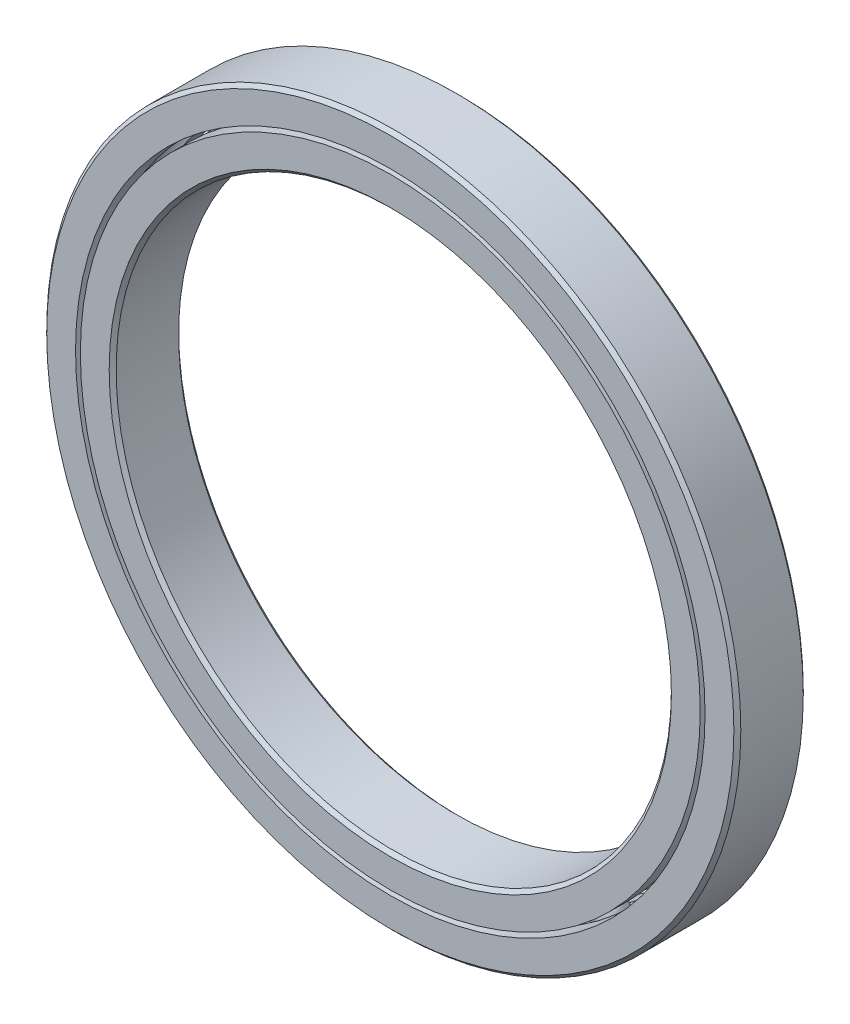
ISO-10303-21;
HEADER;
FILE_DESCRIPTION(('STEP AP214'),'2;1');
FILE_NAME('part.step','',(''),(''),'','','');
FILE_SCHEMA(('AUTOMOTIVE_DESIGN { 1 0 10303 214 1 1 1 1 }'));
ENDSEC;
DATA;
#1=APPLICATION_CONTEXT('core data for automotive mechanical design processes');
#2=APPLICATION_PROTOCOL_DEFINITION('international standard','automotive_design',2000,#1);
#3=PRODUCT_CONTEXT('',#1,'mechanical');
#4=PRODUCT('Part','Part','',(#3));
#5=PRODUCT_RELATED_PRODUCT_CATEGORY('part','',(#4));
#6=PRODUCT_DEFINITION_FORMATION('','',#4);
#7=PRODUCT_DEFINITION_CONTEXT('part definition',#1,'design');
#8=PRODUCT_DEFINITION('design','',#6,#7);
#9=PRODUCT_DEFINITION_SHAPE('','',#8);
#10=(LENGTH_UNIT() NAMED_UNIT(*) SI_UNIT(.MILLI.,.METRE.));
#11=(NAMED_UNIT(*) PLANE_ANGLE_UNIT() SI_UNIT($,.RADIAN.));
#12=(NAMED_UNIT(*) SI_UNIT($,.STERADIAN.) SOLID_ANGLE_UNIT());
#13=UNCERTAINTY_MEASURE_WITH_UNIT(LENGTH_MEASURE(1.E-05),#10,'distance_accuracy_value','');
#14=(GEOMETRIC_REPRESENTATION_CONTEXT(3) GLOBAL_UNCERTAINTY_ASSIGNED_CONTEXT((#13)) GLOBAL_UNIT_ASSIGNED_CONTEXT((#10,
#11,#12)) REPRESENTATION_CONTEXT('',''));
#15=CARTESIAN_POINT('',(0.,0.,0.));
#16=DIRECTION('',(0.,0.,1.));
#17=DIRECTION('',(1.,0.,0.));
#18=AXIS2_PLACEMENT_3D('',#15,#16,#17);
#19=CARTESIAN_POINT('',(-16.7959635842571,23.1176606142643,0.));
#20=DIRECTION('',(0.,0.,1.));
#21=DIRECTION('',(-0.587785252292462,0.809016994374955,0.));
#22=AXIS2_PLACEMENT_3D('',#19,#20,#21);
#23=SPHERICAL_SURFACE('',#22,1.42812814183422);
#24=CARTESIAN_POINT('',(-16.7959635842571,23.1176606142643,1.42812814183422));
#25=VERTEX_POINT('',#24);
#26=VERTEX_LOOP('',#25);
#27=FACE_BOUND('',#26,.T.);
#28=ADVANCED_FACE('F39',(#27),#23,.T.);
#29=CLOSED_SHELL('',(#28));
#30=MANIFOLD_SOLID_BREP('B2',#29);
#31=CARTESIAN_POINT('',(-27.1764399531339,8.83016061426443,0.));
#32=DIRECTION('',(0.,0.,1.));
#33=DIRECTION('',(-0.95105651629515,0.309016994374958,0.));
#34=AXIS2_PLACEMENT_3D('',#31,#32,#33);
#35=SPHERICAL_SURFACE('',#34,1.42812814183422);
#36=CARTESIAN_POINT('',(-27.1764399531339,8.83016061426443,1.42812814183422));
#37=VERTEX_POINT('',#36);
#38=VERTEX_LOOP('',#37);
#39=FACE_BOUND('',#38,.T.);
#40=ADVANCED_FACE('F59',(#39),#35,.T.);
#41=CLOSED_SHELL('',(#40));
#42=MANIFOLD_SOLID_BREP('B6',#41);
#43=CARTESIAN_POINT('',(-27.1764399531341,-8.83016061426386,0.));
#44=DIRECTION('',(0.,0.,1.));
#45=DIRECTION('',(-0.951056516295157,-0.309016994374938,0.));
#46=AXIS2_PLACEMENT_3D('',#43,#44,#45);
#47=SPHERICAL_SURFACE('',#46,1.42812814183422);
#48=CARTESIAN_POINT('',(-27.1764399531341,-8.83016061426386,1.42812814183422));
#49=VERTEX_POINT('',#48);
#50=VERTEX_LOOP('',#49);
#51=FACE_BOUND('',#50,.T.);
#52=ADVANCED_FACE('F79',(#51),#47,.T.);
#53=CLOSED_SHELL('',(#52));
#54=MANIFOLD_SOLID_BREP('B35',#53);
#55=CARTESIAN_POINT('',(-16.7959635842576,-23.117660614264,0.));
#56=DIRECTION('',(0.,0.,1.));
#57=DIRECTION('',(-0.58778525229248,-0.809016994374942,0.));
#58=AXIS2_PLACEMENT_3D('',#55,#56,#57);
#59=SPHERICAL_SURFACE('',#58,1.42812814183422);
#60=CARTESIAN_POINT('',(-16.7959635842576,-23.117660614264,1.42812814183422));
#61=VERTEX_POINT('',#60);
#62=VERTEX_LOOP('',#61);
#63=FACE_BOUND('',#62,.T.);
#64=ADVANCED_FACE('F99',(#63),#59,.T.);
#65=CLOSED_SHELL('',(#64));
#66=MANIFOLD_SOLID_BREP('B55',#65);
#67=CARTESIAN_POINT('',(-1.99538158514885E-13,-28.575,0.));
#68=DIRECTION('',(0.,0.,1.));
#69=DIRECTION('',(0.,-1.,0.));
#70=AXIS2_PLACEMENT_3D('',#67,#68,#69);
#71=SPHERICAL_SURFACE('',#70,1.42812814183422);
#72=CARTESIAN_POINT('',(-1.99538158514885E-13,-28.575,1.42812814183422));
#73=VERTEX_POINT('',#72);
#74=VERTEX_LOOP('',#73);
#75=FACE_BOUND('',#74,.T.);
#76=ADVANCED_FACE('F119',(#75),#71,.T.);
#77=CLOSED_SHELL('',(#76));
#78=MANIFOLD_SOLID_BREP('B75',#77);
#79=CARTESIAN_POINT('',(16.7959635842573,-23.1176606142642,0.));
#80=DIRECTION('',(0.,0.,1.));
#81=DIRECTION('',(0.587785252292469,-0.809016994374951,0.));
#82=AXIS2_PLACEMENT_3D('',#79,#80,#81);
#83=SPHERICAL_SURFACE('',#82,1.42812814183422);
#84=CARTESIAN_POINT('',(16.7959635842573,-23.1176606142642,1.42812814183422));
#85=VERTEX_POINT('',#84);
#86=VERTEX_LOOP('',#85);
#87=FACE_BOUND('',#86,.T.);
#88=ADVANCED_FACE('F139',(#87),#83,.T.);
#89=CLOSED_SHELL('',(#88));
#90=MANIFOLD_SOLID_BREP('B95',#89);
#91=CARTESIAN_POINT('',(27.176439953134,-8.83016061426424,0.));
#92=DIRECTION('',(0.,0.,1.));
#93=DIRECTION('',(0.951056516295152,-0.309016994374952,0.));
#94=AXIS2_PLACEMENT_3D('',#91,#92,#93);
#95=SPHERICAL_SURFACE('',#94,1.42812814183422);
#96=CARTESIAN_POINT('',(27.176439953134,-8.83016061426424,1.42812814183422));
#97=VERTEX_POINT('',#96);
#98=VERTEX_LOOP('',#97);
#99=FACE_BOUND('',#98,.T.);
#100=ADVANCED_FACE('F159',(#99),#95,.T.);
#101=CLOSED_SHELL('',(#100));
#102=MANIFOLD_SOLID_BREP('B115',#101);
#103=CARTESIAN_POINT('',(27.176439953134,8.83016061426405,0.));
#104=DIRECTION('',(0.,0.,1.));
#105=DIRECTION('',(0.951056516295155,0.309016994374945,0.));
#106=AXIS2_PLACEMENT_3D('',#103,#104,#105);
#107=SPHERICAL_SURFACE('',#106,1.42812814183422);
#108=CARTESIAN_POINT('',(27.176439953134,8.83016061426405,1.42812814183422));
#109=VERTEX_POINT('',#108);
#110=VERTEX_LOOP('',#109);
#111=FACE_BOUND('',#110,.T.);
#112=ADVANCED_FACE('F179',(#111),#107,.T.);
#113=CLOSED_SHELL('',(#112));
#114=MANIFOLD_SOLID_BREP('B135',#113);
#115=CARTESIAN_POINT('',(16.7959635842575,23.1176606142641,0.));
#116=DIRECTION('',(0.,0.,1.));
#117=DIRECTION('',(0.587785252292474,0.809016994374947,0.));
#118=AXIS2_PLACEMENT_3D('',#115,#116,#117);
#119=SPHERICAL_SURFACE('',#118,1.42812814183422);
#120=CARTESIAN_POINT('',(16.7959635842575,23.1176606142641,1.42812814183422));
#121=VERTEX_POINT('',#120);
#122=VERTEX_LOOP('',#121);
#123=FACE_BOUND('',#122,.T.);
#124=ADVANCED_FACE('F199',(#123),#119,.T.);
#125=CLOSED_SHELL('',(#124));
#126=MANIFOLD_SOLID_BREP('B155',#125);
#127=CARTESIAN_POINT('',(0.,28.575,0.));
#128=DIRECTION('',(0.,0.,1.));
#129=DIRECTION('',(0.,1.,0.));
#130=AXIS2_PLACEMENT_3D('',#127,#128,#129);
#131=SPHERICAL_SURFACE('',#130,1.42812814183422);
#132=CARTESIAN_POINT('',(0.,28.575,1.42812814183422));
#133=VERTEX_POINT('',#132);
#134=VERTEX_LOOP('',#133);
#135=FACE_BOUND('',#134,.T.);
#136=ADVANCED_FACE('F221',(#135),#131,.T.);
#137=CLOSED_SHELL('',(#136));
#138=MANIFOLD_SOLID_BREP('B175',#137);
#139=CARTESIAN_POINT('',(0.,28.3551923076923,3.17500000000001));
#140=DIRECTION('',(0.,0.,-1.));
#141=DIRECTION('',(-1.,0.,0.));
#142=AXIS2_PLACEMENT_3D('',#139,#140,#141);
#143=PLANE('',#142);
#144=CARTESIAN_POINT('',(0.,0.,3.175));
#145=DIRECTION('',(0.,0.,1.));
#146=DIRECTION('',(1.,0.,0.));
#147=AXIS2_PLACEMENT_3D('',#144,#145,#146);
#148=CIRCLE('',#147,25.7175);
#149=CARTESIAN_POINT('',(25.7175,0.,3.175));
#150=VERTEX_POINT('',#149);
#151=EDGE_CURVE('E268',#150,#150,#148,.T.);
#152=ORIENTED_EDGE('',*,*,#151,.F.);
#153=EDGE_LOOP('',(#152));
#154=FACE_BOUND('',#153,.T.);
#155=CARTESIAN_POINT('',(0.,0.,3.17500000000001));
#156=DIRECTION('',(0.,0.,1.));
#157=DIRECTION('',(1.,0.,0.));
#158=AXIS2_PLACEMENT_3D('',#155,#156,#157);
#159=CIRCLE('',#158,28.3551923076923);
#160=CARTESIAN_POINT('',(28.3551923076923,0.,3.17500000000001));
#161=VERTEX_POINT('',#160);
#162=EDGE_CURVE('E220',#161,#161,#159,.T.);
#163=ORIENTED_EDGE('',*,*,#162,.T.);
#164=EDGE_LOOP('',(#163));
#165=FACE_BOUND('',#164,.T.);
#166=ADVANCED_FACE('F240',(#154,#165),#143,.F.);
#167=CARTESIAN_POINT('',(0.,0.,3.175));
#168=DIRECTION('',(0.,0.,1.));
#169=DIRECTION('',(1.,0.,0.));
#170=AXIS2_PLACEMENT_3D('',#167,#168,#169);
#171=CYLINDRICAL_SURFACE('',#170,28.3551923076923);
#172=ORIENTED_EDGE('',*,*,#162,.F.);
#173=EDGE_LOOP('',(#172));
#174=FACE_BOUND('',#173,.T.);
#175=CARTESIAN_POINT('',(0.,0.,1.41111111111111));
#176=DIRECTION('',(0.,0.,1.));
#177=DIRECTION('',(1.,0.,0.));
#178=AXIS2_PLACEMENT_3D('',#175,#176,#177);
#179=CIRCLE('',#178,28.3551923076923);
#180=CARTESIAN_POINT('',(28.3551923076923,0.,1.41111111111111));
#181=VERTEX_POINT('',#180);
#182=EDGE_CURVE('E246',#181,#181,#179,.T.);
#183=ORIENTED_EDGE('',*,*,#182,.T.);
#184=EDGE_LOOP('',(#183));
#185=FACE_BOUND('',#184,.T.);
#186=ADVANCED_FACE('F275',(#174,#185),#171,.T.);
#187=CARTESIAN_POINT('',(0.,0.,0.));
#188=DIRECTION('',(0.,0.,1.));
#189=DIRECTION('',(1.,0.,0.));
#190=AXIS2_PLACEMENT_3D('',#187,#188,#189);
#191=TOROIDAL_SURFACE('',#190,28.5749999999999,1.42812814183421);
#192=ORIENTED_EDGE('',*,*,#182,.F.);
#193=EDGE_LOOP('',(#192));
#194=FACE_BOUND('',#193,.T.);
#195=CARTESIAN_POINT('',(0.,0.,-1.41111111111112));
#196=DIRECTION('',(0.,0.,1.));
#197=DIRECTION('',(1.,0.,0.));
#198=AXIS2_PLACEMENT_3D('',#195,#196,#197);
#199=CIRCLE('',#198,28.3551923076923);
#200=CARTESIAN_POINT('',(28.3551923076923,0.,-1.41111111111112));
#201=VERTEX_POINT('',#200);
#202=EDGE_CURVE('E250',#201,#201,#199,.T.);
#203=ORIENTED_EDGE('',*,*,#202,.T.);
#204=EDGE_LOOP('',(#203));
#205=FACE_BOUND('',#204,.T.);
#206=ADVANCED_FACE('F279',(#194,#205),#191,.F.);
#207=CARTESIAN_POINT('',(0.,0.,3.175));
#208=DIRECTION('',(0.,0.,1.));
#209=DIRECTION('',(1.,0.,0.));
#210=AXIS2_PLACEMENT_3D('',#207,#208,#209);
#211=CYLINDRICAL_SURFACE('',#210,28.3551923076923);
#212=ORIENTED_EDGE('',*,*,#202,.F.);
#213=EDGE_LOOP('',(#212));
#214=FACE_BOUND('',#213,.T.);
#215=CARTESIAN_POINT('',(0.,0.,-3.17500000000001));
#216=DIRECTION('',(0.,0.,1.));
#217=DIRECTION('',(1.,0.,0.));
#218=AXIS2_PLACEMENT_3D('',#215,#216,#217);
#219=CIRCLE('',#218,28.3551923076923);
#220=CARTESIAN_POINT('',(28.3551923076923,0.,-3.17500000000001));
#221=VERTEX_POINT('',#220);
#222=EDGE_CURVE('E254',#221,#221,#219,.T.);
#223=ORIENTED_EDGE('',*,*,#222,.T.);
#224=EDGE_LOOP('',(#223));
#225=FACE_BOUND('',#224,.T.);
#226=ADVANCED_FACE('F284',(#214,#225),#211,.T.);
#227=CARTESIAN_POINT('',(0.,25.7175,-3.17500000000001));
#228=DIRECTION('',(0.,0.,1.));
#229=DIRECTION('',(1.,0.,0.));
#230=AXIS2_PLACEMENT_3D('',#227,#228,#229);
#231=PLANE('',#230);
#232=ORIENTED_EDGE('',*,*,#222,.F.);
#233=EDGE_LOOP('',(#232));
#234=FACE_BOUND('',#233,.T.);
#235=CARTESIAN_POINT('',(0.,0.,-3.17500000000001));
#236=DIRECTION('',(0.,0.,1.));
#237=DIRECTION('',(1.,0.,0.));
#238=AXIS2_PLACEMENT_3D('',#235,#236,#237);
#239=CIRCLE('',#238,25.7175);
#240=CARTESIAN_POINT('',(25.7175,0.,-3.17500000000001));
#241=VERTEX_POINT('',#240);
#242=EDGE_CURVE('E259',#241,#241,#239,.T.);
#243=ORIENTED_EDGE('',*,*,#242,.T.);
#244=EDGE_LOOP('',(#243));
#245=FACE_BOUND('',#244,.T.);
#246=ADVANCED_FACE('F290',(#234,#245),#231,.F.);
#247=CARTESIAN_POINT('',(0.,0.,-2.8575));
#248=DIRECTION('',(0.,0.,-1.));
#249=DIRECTION('',(-1.,0.,0.));
#250=AXIS2_PLACEMENT_3D('',#247,#248,#249);
#251=CONICAL_SURFACE('',#250,25.4,0.785398163397444);
#252=ORIENTED_EDGE('',*,*,#242,.F.);
#253=EDGE_LOOP('',(#252));
#254=FACE_BOUND('',#253,.T.);
#255=CARTESIAN_POINT('',(0.,0.,-2.8575));
#256=DIRECTION('',(0.,0.,1.));
#257=DIRECTION('',(1.,0.,0.));
#258=AXIS2_PLACEMENT_3D('',#255,#256,#257);
#259=CIRCLE('',#258,25.4);
#260=CARTESIAN_POINT('',(25.4,0.,-2.8575));
#261=VERTEX_POINT('',#260);
#262=EDGE_CURVE('E262',#261,#261,#259,.T.);
#263=ORIENTED_EDGE('',*,*,#262,.T.);
#264=EDGE_LOOP('',(#263));
#265=FACE_BOUND('',#264,.T.);
#266=ADVANCED_FACE('F294',(#254,#265),#251,.F.);
#267=CARTESIAN_POINT('',(0.,0.,3.175));
#268=DIRECTION('',(0.,0.,1.));
#269=DIRECTION('',(1.,0.,0.));
#270=AXIS2_PLACEMENT_3D('',#267,#268,#269);
#271=CYLINDRICAL_SURFACE('',#270,25.4);
#272=ORIENTED_EDGE('',*,*,#262,.F.);
#273=EDGE_LOOP('',(#272));
#274=FACE_BOUND('',#273,.T.);
#275=CARTESIAN_POINT('',(0.,0.,2.8575));
#276=DIRECTION('',(0.,0.,1.));
#277=DIRECTION('',(1.,0.,0.));
#278=AXIS2_PLACEMENT_3D('',#275,#276,#277);
#279=CIRCLE('',#278,25.4);
#280=CARTESIAN_POINT('',(25.4,0.,2.8575));
#281=VERTEX_POINT('',#280);
#282=EDGE_CURVE('E265',#281,#281,#279,.T.);
#283=ORIENTED_EDGE('',*,*,#282,.T.);
#284=EDGE_LOOP('',(#283));
#285=FACE_BOUND('',#284,.T.);
#286=ADVANCED_FACE('F298',(#274,#285),#271,.F.);
#287=CARTESIAN_POINT('',(0.,0.,3.175));
#288=DIRECTION('',(0.,0.,1.));
#289=DIRECTION('',(1.,0.,0.));
#290=AXIS2_PLACEMENT_3D('',#287,#288,#289);
#291=CONICAL_SURFACE('',#290,25.7175,0.785398163397445);
#292=ORIENTED_EDGE('',*,*,#282,.F.);
#293=EDGE_LOOP('',(#292));
#294=FACE_BOUND('',#293,.T.);
#295=ORIENTED_EDGE('',*,*,#151,.T.);
#296=EDGE_LOOP('',(#295));
#297=FACE_BOUND('',#296,.T.);
#298=ADVANCED_FACE('F272',(#294,#297),#291,.F.);
#299=CLOSED_SHELL('',(#166,#186,#206,#226,#246,#266,#286,#298));
#300=MANIFOLD_SOLID_BREP('B195',#299);
#301=CARTESIAN_POINT('',(0.,0.,2.8575));
#302=DIRECTION('',(0.,0.,-1.));
#303=DIRECTION('',(-1.,0.,0.));
#304=AXIS2_PLACEMENT_3D('',#301,#302,#303);
#305=CONICAL_SURFACE('',#304,31.75,0.785398163397446);
#306=CARTESIAN_POINT('',(0.,0.,3.175));
#307=DIRECTION('',(0.,0.,1.));
#308=DIRECTION('',(1.,0.,0.));
#309=AXIS2_PLACEMENT_3D('',#306,#307,#308);
#310=CIRCLE('',#309,31.4325);
#311=CARTESIAN_POINT('',(31.4325,0.,3.175));
#312=VERTEX_POINT('',#311);
#313=EDGE_CURVE('E389',#312,#312,#310,.T.);
#314=ORIENTED_EDGE('',*,*,#313,.F.);
#315=EDGE_LOOP('',(#314));
#316=FACE_BOUND('',#315,.T.);
#317=CARTESIAN_POINT('',(0.,0.,2.8575));
#318=DIRECTION('',(0.,0.,1.));
#319=DIRECTION('',(1.,0.,0.));
#320=AXIS2_PLACEMENT_3D('',#317,#318,#319);
#321=CIRCLE('',#320,31.75);
#322=CARTESIAN_POINT('',(31.75,0.,2.8575));
#323=VERTEX_POINT('',#322);
#324=EDGE_CURVE('E239',#323,#323,#321,.T.);
#325=ORIENTED_EDGE('',*,*,#324,.T.);
#326=EDGE_LOOP('',(#325));
#327=FACE_BOUND('',#326,.T.);
#328=ADVANCED_FACE('F361',(#316,#327),#305,.T.);
#329=CARTESIAN_POINT('',(0.,0.,3.175));
#330=DIRECTION('',(0.,0.,1.));
#331=DIRECTION('',(1.,0.,0.));
#332=AXIS2_PLACEMENT_3D('',#329,#330,#331);
#333=CYLINDRICAL_SURFACE('',#332,31.75);
#334=ORIENTED_EDGE('',*,*,#324,.F.);
#335=EDGE_LOOP('',(#334));
#336=FACE_BOUND('',#335,.T.);
#337=CARTESIAN_POINT('',(0.,0.,-2.8575));
#338=DIRECTION('',(0.,0.,1.));
#339=DIRECTION('',(1.,0.,0.));
#340=AXIS2_PLACEMENT_3D('',#337,#338,#339);
#341=CIRCLE('',#340,31.75);
#342=CARTESIAN_POINT('',(31.75,0.,-2.8575));
#343=VERTEX_POINT('',#342);
#344=EDGE_CURVE('E367',#343,#343,#341,.T.);
#345=ORIENTED_EDGE('',*,*,#344,.T.);
#346=EDGE_LOOP('',(#345));
#347=FACE_BOUND('',#346,.T.);
#348=ADVANCED_FACE('F396',(#336,#347),#333,.T.);
#349=CARTESIAN_POINT('',(0.,0.,-3.17500000000001));
#350=DIRECTION('',(0.,0.,1.));
#351=DIRECTION('',(1.,0.,0.));
#352=AXIS2_PLACEMENT_3D('',#349,#350,#351);
#353=CONICAL_SURFACE('',#352,31.4325,0.785398163397444);
#354=ORIENTED_EDGE('',*,*,#344,.F.);
#355=EDGE_LOOP('',(#354));
#356=FACE_BOUND('',#355,.T.);
#357=CARTESIAN_POINT('',(0.,0.,-3.17500000000001));
#358=DIRECTION('',(0.,0.,1.));
#359=DIRECTION('',(1.,0.,0.));
#360=AXIS2_PLACEMENT_3D('',#357,#358,#359);
#361=CIRCLE('',#360,31.4325);
#362=CARTESIAN_POINT('',(31.4325,0.,-3.17500000000001));
#363=VERTEX_POINT('',#362);
#364=EDGE_CURVE('E371',#363,#363,#361,.T.);
#365=ORIENTED_EDGE('',*,*,#364,.T.);
#366=EDGE_LOOP('',(#365));
#367=FACE_BOUND('',#366,.T.);
#368=ADVANCED_FACE('F400',(#356,#367),#353,.T.);
#369=CARTESIAN_POINT('',(0.,31.4325,-3.175));
#370=DIRECTION('',(0.,0.,1.));
#371=DIRECTION('',(1.,0.,0.));
#372=AXIS2_PLACEMENT_3D('',#369,#370,#371);
#373=PLANE('',#372);
#374=ORIENTED_EDGE('',*,*,#364,.F.);
#375=EDGE_LOOP('',(#374));
#376=FACE_BOUND('',#375,.T.);
#377=CARTESIAN_POINT('',(0.,0.,-3.175));
#378=DIRECTION('',(0.,0.,1.));
#379=DIRECTION('',(1.,0.,0.));
#380=AXIS2_PLACEMENT_3D('',#377,#378,#379);
#381=CIRCLE('',#380,28.7948076923077);
#382=CARTESIAN_POINT('',(28.7948076923077,0.,-3.175));
#383=VERTEX_POINT('',#382);
#384=EDGE_CURVE('E375',#383,#383,#381,.T.);
#385=ORIENTED_EDGE('',*,*,#384,.T.);
#386=EDGE_LOOP('',(#385));
#387=FACE_BOUND('',#386,.T.);
#388=ADVANCED_FACE('F405',(#376,#387),#373,.F.);
#389=CARTESIAN_POINT('',(0.,0.,3.175));
#390=DIRECTION('',(0.,0.,1.));
#391=DIRECTION('',(1.,0.,0.));
#392=AXIS2_PLACEMENT_3D('',#389,#390,#391);
#393=CYLINDRICAL_SURFACE('',#392,28.7948076923077);
#394=ORIENTED_EDGE('',*,*,#384,.F.);
#395=EDGE_LOOP('',(#394));
#396=FACE_BOUND('',#395,.T.);
#397=CARTESIAN_POINT('',(0.,0.,-1.41111111111111));
#398=DIRECTION('',(0.,0.,1.));
#399=DIRECTION('',(1.,0.,0.));
#400=AXIS2_PLACEMENT_3D('',#397,#398,#399);
#401=CIRCLE('',#400,28.7948076923077);
#402=CARTESIAN_POINT('',(28.7948076923077,0.,-1.41111111111111));
#403=VERTEX_POINT('',#402);
#404=EDGE_CURVE('E380',#403,#403,#401,.T.);
#405=ORIENTED_EDGE('',*,*,#404,.T.);
#406=EDGE_LOOP('',(#405));
#407=FACE_BOUND('',#406,.T.);
#408=ADVANCED_FACE('F411',(#396,#407),#393,.F.);
#409=CARTESIAN_POINT('',(0.,0.,0.));
#410=DIRECTION('',(0.,0.,1.));
#411=DIRECTION('',(1.,0.,0.));
#412=AXIS2_PLACEMENT_3D('',#409,#410,#411);
#413=TOROIDAL_SURFACE('',#412,28.575,1.42812814183422);
#414=ORIENTED_EDGE('',*,*,#404,.F.);
#415=EDGE_LOOP('',(#414));
#416=FACE_BOUND('',#415,.T.);
#417=CARTESIAN_POINT('',(0.,0.,1.41111111111111));
#418=DIRECTION('',(0.,0.,1.));
#419=DIRECTION('',(1.,0.,0.));
#420=AXIS2_PLACEMENT_3D('',#417,#418,#419);
#421=CIRCLE('',#420,28.7948076923077);
#422=CARTESIAN_POINT('',(28.7948076923077,0.,1.41111111111111));
#423=VERTEX_POINT('',#422);
#424=EDGE_CURVE('E383',#423,#423,#421,.T.);
#425=ORIENTED_EDGE('',*,*,#424,.T.);
#426=EDGE_LOOP('',(#425));
#427=FACE_BOUND('',#426,.T.);
#428=ADVANCED_FACE('F415',(#416,#427),#413,.F.);
#429=CARTESIAN_POINT('',(0.,0.,3.175));
#430=DIRECTION('',(0.,0.,1.));
#431=DIRECTION('',(1.,0.,0.));
#432=AXIS2_PLACEMENT_3D('',#429,#430,#431);
#433=CYLINDRICAL_SURFACE('',#432,28.7948076923077);
#434=ORIENTED_EDGE('',*,*,#424,.F.);
#435=EDGE_LOOP('',(#434));
#436=FACE_BOUND('',#435,.T.);
#437=CARTESIAN_POINT('',(0.,0.,3.175));
#438=DIRECTION('',(0.,0.,1.));
#439=DIRECTION('',(1.,0.,0.));
#440=AXIS2_PLACEMENT_3D('',#437,#438,#439);
#441=CIRCLE('',#440,28.7948076923077);
#442=CARTESIAN_POINT('',(28.7948076923077,0.,3.175));
#443=VERTEX_POINT('',#442);
#444=EDGE_CURVE('E386',#443,#443,#441,.T.);
#445=ORIENTED_EDGE('',*,*,#444,.T.);
#446=EDGE_LOOP('',(#445));
#447=FACE_BOUND('',#446,.T.);
#448=ADVANCED_FACE('F419',(#436,#447),#433,.F.);
#449=CARTESIAN_POINT('',(0.,31.4325,3.175));
#450=DIRECTION('',(0.,0.,-1.));
#451=DIRECTION('',(-1.,0.,0.));
#452=AXIS2_PLACEMENT_3D('',#449,#450,#451);
#453=PLANE('',#452);
#454=ORIENTED_EDGE('',*,*,#444,.F.);
#455=EDGE_LOOP('',(#454));
#456=FACE_BOUND('',#455,.T.);
#457=ORIENTED_EDGE('',*,*,#313,.T.);
#458=EDGE_LOOP('',(#457));
#459=FACE_BOUND('',#458,.T.);
#460=ADVANCED_FACE('F393',(#456,#459),#453,.F.);
#461=CLOSED_SHELL('',(#328,#348,#368,#388,#408,#428,#448,#460));
#462=MANIFOLD_SOLID_BREP('B215',#461);
#463=ADVANCED_BREP_SHAPE_REPRESENTATION('',(#18,#30,#42,#54,#66,#78,#90,#102,#114,#126,#138,
#300,#462),#14);
#464=SHAPE_DEFINITION_REPRESENTATION(#9,#463);
ENDSEC;
END-ISO-10303-21;
